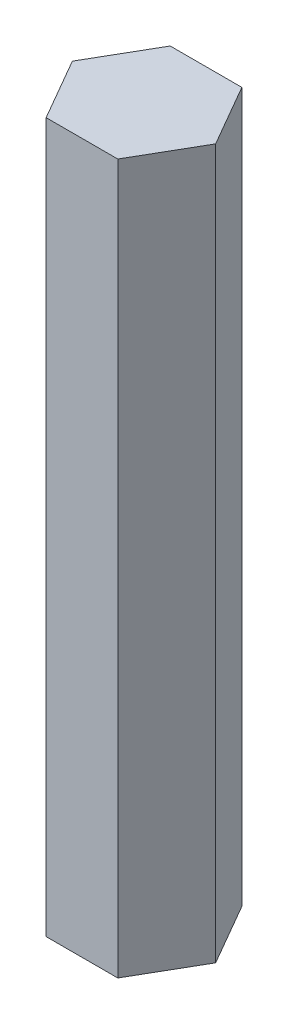
ISO-10303-21;
HEADER;
FILE_DESCRIPTION(('STEP AP214'),'2;1');
FILE_NAME('part.step','',(''),(''),'','','');
FILE_SCHEMA(('AUTOMOTIVE_DESIGN { 1 0 10303 214 1 1 1 1 }'));
ENDSEC;
DATA;
#1=APPLICATION_CONTEXT('core data for automotive mechanical design processes');
#2=APPLICATION_PROTOCOL_DEFINITION('international standard','automotive_design',2000,#1);
#3=PRODUCT_CONTEXT('',#1,'mechanical');
#4=PRODUCT('Part','Part','',(#3));
#5=PRODUCT_RELATED_PRODUCT_CATEGORY('part','',(#4));
#6=PRODUCT_DEFINITION_FORMATION('','',#4);
#7=PRODUCT_DEFINITION_CONTEXT('part definition',#1,'design');
#8=PRODUCT_DEFINITION('design','',#6,#7);
#9=PRODUCT_DEFINITION_SHAPE('','',#8);
#10=(LENGTH_UNIT() NAMED_UNIT(*) SI_UNIT(.MILLI.,.METRE.));
#11=(NAMED_UNIT(*) PLANE_ANGLE_UNIT() SI_UNIT($,.RADIAN.));
#12=(NAMED_UNIT(*) SI_UNIT($,.STERADIAN.) SOLID_ANGLE_UNIT());
#13=UNCERTAINTY_MEASURE_WITH_UNIT(LENGTH_MEASURE(1.E-05),#10,'distance_accuracy_value','');
#14=(GEOMETRIC_REPRESENTATION_CONTEXT(3) GLOBAL_UNCERTAINTY_ASSIGNED_CONTEXT((#13)) GLOBAL_UNIT_ASSIGNED_CONTEXT((#10,
#11,#12)) REPRESENTATION_CONTEXT('',''));
#15=CARTESIAN_POINT('',(0.,0.,0.));
#16=DIRECTION('',(0.,0.,1.));
#17=DIRECTION('',(1.,0.,0.));
#18=AXIS2_PLACEMENT_3D('',#15,#16,#17);
#19=CARTESIAN_POINT('',(3.,29.7,0.));
#20=DIRECTION('',(-0.866025403784439,0.,0.5));
#21=DIRECTION('',(0.5,0.,0.866025403784439));
#22=AXIS2_PLACEMENT_3D('',#19,#20,#21);
#23=PLANE('',#22);
#24=DIRECTION('',(-0.5,0.,-0.866025403784439));
#25=VECTOR('',#24,1.);
#26=CARTESIAN_POINT('',(3.,0.,0.));
#27=LINE('',#26,#25);
#28=CARTESIAN_POINT('',(3.,0.,0.));
#29=VERTEX_POINT('',#28);
#30=CARTESIAN_POINT('',(1.5,0.,-2.59807621135332));
#31=VERTEX_POINT('',#30);
#32=EDGE_CURVE('E117',#29,#31,#27,.T.);
#33=ORIENTED_EDGE('',*,*,#32,.T.);
#34=DIRECTION('',(0.,-1.,0.));
#35=VECTOR('',#34,1.);
#36=CARTESIAN_POINT('',(1.5,29.7,-2.59807621135332));
#37=LINE('',#36,#35);
#38=CARTESIAN_POINT('',(1.5,29.7,-2.59807621135332));
#39=VERTEX_POINT('',#38);
#40=EDGE_CURVE('E11',#39,#31,#37,.T.);
#41=ORIENTED_EDGE('',*,*,#40,.F.);
#42=DIRECTION('',(-0.5,0.,-0.866025403784439));
#43=VECTOR('',#42,1.);
#44=CARTESIAN_POINT('',(3.,29.7,0.));
#45=LINE('',#44,#43);
#46=CARTESIAN_POINT('',(3.,29.7,0.));
#47=VERTEX_POINT('',#46);
#48=EDGE_CURVE('E127',#47,#39,#45,.T.);
#49=ORIENTED_EDGE('',*,*,#48,.F.);
#50=DIRECTION('',(0.,-1.,0.));
#51=VECTOR('',#50,1.);
#52=CARTESIAN_POINT('',(3.,29.7,0.));
#53=LINE('',#52,#51);
#54=EDGE_CURVE('E113',#47,#29,#53,.T.);
#55=ORIENTED_EDGE('',*,*,#54,.T.);
#56=EDGE_LOOP('',(#33,#41,#49,#55));
#57=FACE_BOUND('',#56,.T.);
#58=ADVANCED_FACE('F33',(#57),#23,.F.);
#59=CARTESIAN_POINT('',(1.5,29.7,-2.59807621135332));
#60=DIRECTION('',(0.,0.,1.));
#61=DIRECTION('',(1.,0.,0.));
#62=AXIS2_PLACEMENT_3D('',#59,#60,#61);
#63=PLANE('',#62);
#64=DIRECTION('',(-1.,0.,0.));
#65=VECTOR('',#64,1.);
#66=CARTESIAN_POINT('',(1.5,0.,-2.59807621135332));
#67=LINE('',#66,#65);
#68=CARTESIAN_POINT('',(-1.5,0.,-2.59807621135332));
#69=VERTEX_POINT('',#68);
#70=EDGE_CURVE('E120',#31,#69,#67,.T.);
#71=ORIENTED_EDGE('',*,*,#70,.T.);
#72=DIRECTION('',(0.,-1.,0.));
#73=VECTOR('',#72,1.);
#74=CARTESIAN_POINT('',(-1.5,29.7,-2.59807621135332));
#75=LINE('',#74,#73);
#76=CARTESIAN_POINT('',(-1.5,29.7,-2.59807621135332));
#77=VERTEX_POINT('',#76);
#78=EDGE_CURVE('E41',#77,#69,#75,.T.);
#79=ORIENTED_EDGE('',*,*,#78,.F.);
#80=DIRECTION('',(-1.,0.,0.));
#81=VECTOR('',#80,1.);
#82=CARTESIAN_POINT('',(1.5,29.7,-2.59807621135332));
#83=LINE('',#82,#81);
#84=EDGE_CURVE('E86',#39,#77,#83,.T.);
#85=ORIENTED_EDGE('',*,*,#84,.F.);
#86=ORIENTED_EDGE('',*,*,#40,.T.);
#87=EDGE_LOOP('',(#71,#79,#85,#86));
#88=FACE_BOUND('',#87,.T.);
#89=ADVANCED_FACE('F151',(#88),#63,.F.);
#90=CARTESIAN_POINT('',(-1.5,29.7,-2.59807621135332));
#91=DIRECTION('',(0.866025403784439,0.,0.5));
#92=DIRECTION('',(0.5,0.,-0.866025403784439));
#93=AXIS2_PLACEMENT_3D('',#90,#91,#92);
#94=PLANE('',#93);
#95=DIRECTION('',(-0.5,0.,0.866025403784439));
#96=VECTOR('',#95,1.);
#97=CARTESIAN_POINT('',(-1.5,0.,-2.59807621135332));
#98=LINE('',#97,#96);
#99=CARTESIAN_POINT('',(-3.,0.,0.));
#100=VERTEX_POINT('',#99);
#101=EDGE_CURVE('E122',#69,#100,#98,.T.);
#102=ORIENTED_EDGE('',*,*,#101,.T.);
#103=DIRECTION('',(0.,-1.,0.));
#104=VECTOR('',#103,1.);
#105=CARTESIAN_POINT('',(-3.,29.7,0.));
#106=LINE('',#105,#104);
#107=CARTESIAN_POINT('',(-3.,29.7,0.));
#108=VERTEX_POINT('',#107);
#109=EDGE_CURVE('E108',#108,#100,#106,.T.);
#110=ORIENTED_EDGE('',*,*,#109,.F.);
#111=DIRECTION('',(-0.5,0.,0.866025403784439));
#112=VECTOR('',#111,1.);
#113=CARTESIAN_POINT('',(-1.5,29.7,-2.59807621135332));
#114=LINE('',#113,#112);
#115=EDGE_CURVE('E99',#77,#108,#114,.T.);
#116=ORIENTED_EDGE('',*,*,#115,.F.);
#117=ORIENTED_EDGE('',*,*,#78,.T.);
#118=EDGE_LOOP('',(#102,#110,#116,#117));
#119=FACE_BOUND('',#118,.T.);
#120=ADVANCED_FACE('F133',(#119),#94,.F.);
#121=CARTESIAN_POINT('',(-3.,29.7,0.));
#122=DIRECTION('',(0.866025403784439,0.,-0.5));
#123=DIRECTION('',(-0.5,0.,-0.866025403784439));
#124=AXIS2_PLACEMENT_3D('',#121,#122,#123);
#125=PLANE('',#124);
#126=DIRECTION('',(0.5,0.,0.866025403784439));
#127=VECTOR('',#126,1.);
#128=CARTESIAN_POINT('',(-3.,0.,0.));
#129=LINE('',#128,#127);
#130=CARTESIAN_POINT('',(-1.5,0.,2.59807621135332));
#131=VERTEX_POINT('',#130);
#132=EDGE_CURVE('E107',#100,#131,#129,.T.);
#133=ORIENTED_EDGE('',*,*,#132,.T.);
#134=DIRECTION('',(0.,-1.,0.));
#135=VECTOR('',#134,1.);
#136=CARTESIAN_POINT('',(-1.5,29.7,2.59807621135332));
#137=LINE('',#136,#135);
#138=CARTESIAN_POINT('',(-1.5,29.7,2.59807621135332));
#139=VERTEX_POINT('',#138);
#140=EDGE_CURVE('E104',#139,#131,#137,.T.);
#141=ORIENTED_EDGE('',*,*,#140,.F.);
#142=DIRECTION('',(0.5,0.,0.866025403784439));
#143=VECTOR('',#142,1.);
#144=CARTESIAN_POINT('',(-3.,29.7,0.));
#145=LINE('',#144,#143);
#146=EDGE_CURVE('E93',#108,#139,#145,.T.);
#147=ORIENTED_EDGE('',*,*,#146,.F.);
#148=ORIENTED_EDGE('',*,*,#109,.T.);
#149=EDGE_LOOP('',(#133,#141,#147,#148));
#150=FACE_BOUND('',#149,.T.);
#151=ADVANCED_FACE('F105',(#150),#125,.F.);
#152=CARTESIAN_POINT('',(-1.5,29.7,2.59807621135332));
#153=DIRECTION('',(0.,0.,-1.));
#154=DIRECTION('',(-1.,0.,0.));
#155=AXIS2_PLACEMENT_3D('',#152,#153,#154);
#156=PLANE('',#155);
#157=DIRECTION('',(1.,0.,0.));
#158=VECTOR('',#157,1.);
#159=CARTESIAN_POINT('',(-1.5,0.,2.59807621135332));
#160=LINE('',#159,#158);
#161=CARTESIAN_POINT('',(1.5,0.,2.59807621135332));
#162=VERTEX_POINT('',#161);
#163=EDGE_CURVE('E72',#131,#162,#160,.T.);
#164=ORIENTED_EDGE('',*,*,#163,.T.);
#165=DIRECTION('',(0.,-1.,0.));
#166=VECTOR('',#165,1.);
#167=CARTESIAN_POINT('',(1.5,29.7,2.59807621135332));
#168=LINE('',#167,#166);
#169=CARTESIAN_POINT('',(1.5,29.7,2.59807621135332));
#170=VERTEX_POINT('',#169);
#171=EDGE_CURVE('E109',#170,#162,#168,.T.);
#172=ORIENTED_EDGE('',*,*,#171,.F.);
#173=DIRECTION('',(1.,0.,0.));
#174=VECTOR('',#173,1.);
#175=CARTESIAN_POINT('',(-1.5,29.7,2.59807621135332));
#176=LINE('',#175,#174);
#177=EDGE_CURVE('E97',#139,#170,#176,.T.);
#178=ORIENTED_EDGE('',*,*,#177,.F.);
#179=ORIENTED_EDGE('',*,*,#140,.T.);
#180=EDGE_LOOP('',(#164,#172,#178,#179));
#181=FACE_BOUND('',#180,.T.);
#182=ADVANCED_FACE('F111',(#181),#156,.F.);
#183=CARTESIAN_POINT('',(1.5,29.7,2.59807621135332));
#184=DIRECTION('',(-0.866025403784439,0.,-0.5));
#185=DIRECTION('',(-0.5,0.,0.866025403784439));
#186=AXIS2_PLACEMENT_3D('',#183,#184,#185);
#187=PLANE('',#186);
#188=DIRECTION('',(0.5,0.,-0.866025403784438));
#189=VECTOR('',#188,1.);
#190=CARTESIAN_POINT('',(1.5,0.,2.59807621135332));
#191=LINE('',#190,#189);
#192=EDGE_CURVE('E78',#162,#29,#191,.T.);
#193=ORIENTED_EDGE('',*,*,#192,.T.);
#194=ORIENTED_EDGE('',*,*,#54,.F.);
#195=DIRECTION('',(0.5,0.,-0.866025403784438));
#196=VECTOR('',#195,1.);
#197=CARTESIAN_POINT('',(1.5,29.7,2.59807621135332));
#198=LINE('',#197,#196);
#199=EDGE_CURVE('E49',#170,#47,#198,.T.);
#200=ORIENTED_EDGE('',*,*,#199,.F.);
#201=ORIENTED_EDGE('',*,*,#171,.T.);
#202=EDGE_LOOP('',(#193,#194,#200,#201));
#203=FACE_BOUND('',#202,.T.);
#204=ADVANCED_FACE('F140',(#203),#187,.F.);
#205=CARTESIAN_POINT('',(0.,29.7,0.));
#206=DIRECTION('',(0.,1.,0.));
#207=DIRECTION('',(0.,0.,1.));
#208=AXIS2_PLACEMENT_3D('',#205,#206,#207);
#209=PLANE('',#208);
#210=ORIENTED_EDGE('',*,*,#48,.T.);
#211=ORIENTED_EDGE('',*,*,#84,.T.);
#212=ORIENTED_EDGE('',*,*,#115,.T.);
#213=ORIENTED_EDGE('',*,*,#146,.T.);
#214=ORIENTED_EDGE('',*,*,#177,.T.);
#215=ORIENTED_EDGE('',*,*,#199,.T.);
#216=EDGE_LOOP('',(#210,#211,#212,#213,#214,#215));
#217=FACE_BOUND('',#216,.T.);
#218=ADVANCED_FACE('F95',(#217),#209,.T.);
#219=CARTESIAN_POINT('',(0.,0.,0.));
#220=DIRECTION('',(0.,1.,0.));
#221=DIRECTION('',(0.,0.,1.));
#222=AXIS2_PLACEMENT_3D('',#219,#220,#221);
#223=PLANE('',#222);
#224=ORIENTED_EDGE('',*,*,#32,.F.);
#225=ORIENTED_EDGE('',*,*,#192,.F.);
#226=ORIENTED_EDGE('',*,*,#163,.F.);
#227=ORIENTED_EDGE('',*,*,#132,.F.);
#228=ORIENTED_EDGE('',*,*,#101,.F.);
#229=ORIENTED_EDGE('',*,*,#70,.F.);
#230=EDGE_LOOP('',(#224,#225,#226,#227,#228,#229));
#231=FACE_BOUND('',#230,.T.);
#232=ADVANCED_FACE('F136',(#231),#223,.F.);
#233=CLOSED_SHELL('',(#58,#89,#120,#151,#182,#204,#218,#232));
#234=MANIFOLD_SOLID_BREP('B2',#233);
#235=ADVANCED_BREP_SHAPE_REPRESENTATION('',(#18,#234),#14);
#236=SHAPE_DEFINITION_REPRESENTATION(#9,#235);
ENDSEC;
END-ISO-10303-21;
